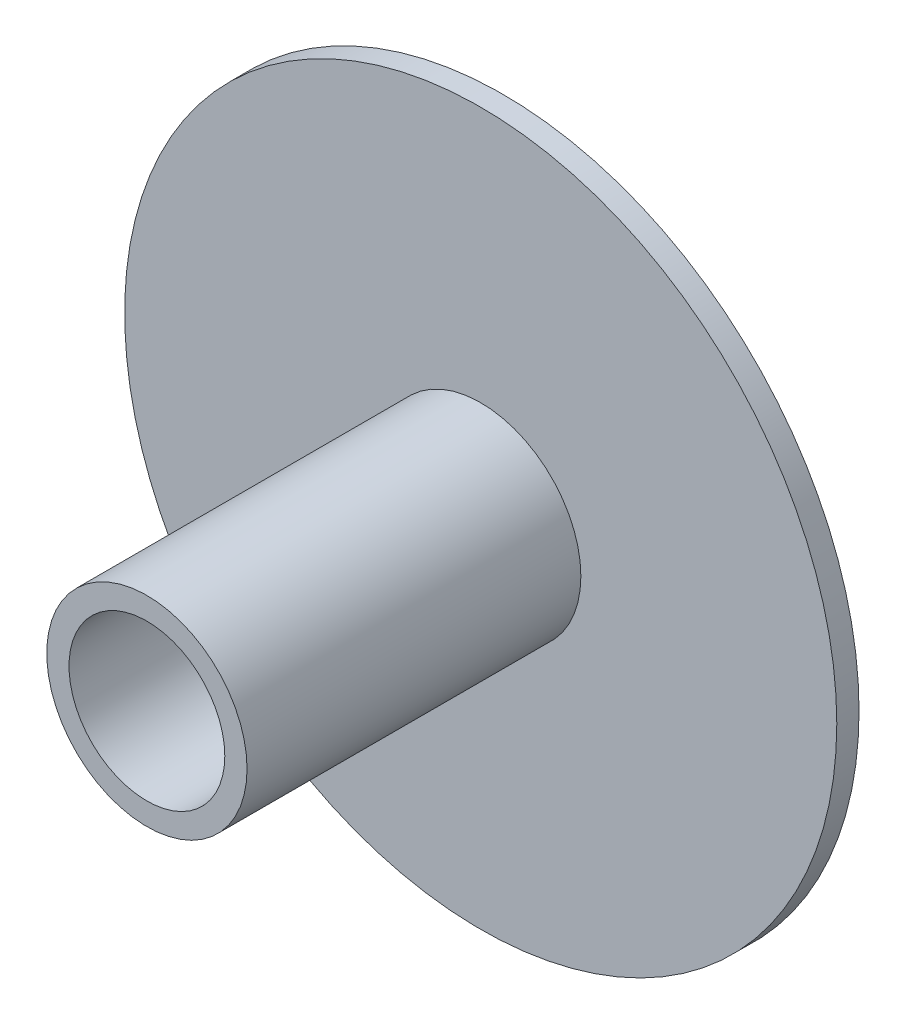
ISO-10303-21;
HEADER;
FILE_DESCRIPTION(('STEP AP214'),'2;1');
FILE_NAME('part.step','',(''),(''),'','','');
FILE_SCHEMA(('AUTOMOTIVE_DESIGN { 1 0 10303 214 1 1 1 1 }'));
ENDSEC;
DATA;
#1=APPLICATION_CONTEXT('core data for automotive mechanical design processes');
#2=APPLICATION_PROTOCOL_DEFINITION('international standard','automotive_design',2000,#1);
#3=PRODUCT_CONTEXT('',#1,'mechanical');
#4=PRODUCT('Part','Part','',(#3));
#5=PRODUCT_RELATED_PRODUCT_CATEGORY('part','',(#4));
#6=PRODUCT_DEFINITION_FORMATION('','',#4);
#7=PRODUCT_DEFINITION_CONTEXT('part definition',#1,'design');
#8=PRODUCT_DEFINITION('design','',#6,#7);
#9=PRODUCT_DEFINITION_SHAPE('','',#8);
#10=(LENGTH_UNIT() NAMED_UNIT(*) SI_UNIT(.MILLI.,.METRE.));
#11=(NAMED_UNIT(*) PLANE_ANGLE_UNIT() SI_UNIT($,.RADIAN.));
#12=(NAMED_UNIT(*) SI_UNIT($,.STERADIAN.) SOLID_ANGLE_UNIT());
#13=UNCERTAINTY_MEASURE_WITH_UNIT(LENGTH_MEASURE(1.E-05),#10,'distance_accuracy_value','');
#14=(GEOMETRIC_REPRESENTATION_CONTEXT(3) GLOBAL_UNCERTAINTY_ASSIGNED_CONTEXT((#13)) GLOBAL_UNIT_ASSIGNED_CONTEXT((#10,
#11,#12)) REPRESENTATION_CONTEXT('',''));
#15=CARTESIAN_POINT('',(0.,0.,0.));
#16=DIRECTION('',(0.,0.,1.));
#17=DIRECTION('',(1.,0.,0.));
#18=AXIS2_PLACEMENT_3D('',#15,#16,#17);
#19=CARTESIAN_POINT('',(0.,0.,1.));
#20=DIRECTION('',(0.,0.,-1.));
#21=DIRECTION('',(-1.,0.,0.));
#22=AXIS2_PLACEMENT_3D('',#19,#20,#21);
#23=CYLINDRICAL_SURFACE('',#22,16.);
#24=CARTESIAN_POINT('',(0.,0.,1.));
#25=DIRECTION('',(0.,0.,1.));
#26=DIRECTION('',(1.,0.,0.));
#27=AXIS2_PLACEMENT_3D('',#24,#25,#26);
#28=CIRCLE('',#27,16.);
#29=CARTESIAN_POINT('',(16.,0.,1.));
#30=VERTEX_POINT('',#29);
#31=EDGE_CURVE('E10',#30,#30,#28,.T.);
#32=ORIENTED_EDGE('',*,*,#31,.F.);
#33=EDGE_LOOP('',(#32));
#34=FACE_BOUND('',#33,.T.);
#35=CARTESIAN_POINT('',(0.,0.,0.));
#36=DIRECTION('',(0.,0.,1.));
#37=DIRECTION('',(1.,0.,0.));
#38=AXIS2_PLACEMENT_3D('',#35,#36,#37);
#39=CIRCLE('',#38,16.);
#40=CARTESIAN_POINT('',(16.,0.,0.));
#41=VERTEX_POINT('',#40);
#42=EDGE_CURVE('E38',#41,#41,#39,.T.);
#43=ORIENTED_EDGE('',*,*,#42,.T.);
#44=EDGE_LOOP('',(#43));
#45=FACE_BOUND('',#44,.T.);
#46=ADVANCED_FACE('F31',(#34,#45),#23,.T.);
#47=CARTESIAN_POINT('',(0.,0.,1.));
#48=DIRECTION('',(0.,0.,1.));
#49=DIRECTION('',(1.,0.,0.));
#50=AXIS2_PLACEMENT_3D('',#47,#48,#49);
#51=PLANE('',#50);
#52=CARTESIAN_POINT('',(0.,0.,1.));
#53=DIRECTION('',(0.,0.,1.));
#54=DIRECTION('',(1.,0.,0.));
#55=AXIS2_PLACEMENT_3D('',#52,#53,#54);
#56=CIRCLE('',#55,4.5);
#57=CARTESIAN_POINT('',(4.5,0.,1.));
#58=VERTEX_POINT('',#57);
#59=EDGE_CURVE('E45',#58,#58,#56,.T.);
#60=ORIENTED_EDGE('',*,*,#59,.F.);
#61=EDGE_LOOP('',(#60));
#62=FACE_BOUND('',#61,.T.);
#63=ORIENTED_EDGE('',*,*,#31,.T.);
#64=EDGE_LOOP('',(#63));
#65=FACE_BOUND('',#64,.T.);
#66=ADVANCED_FACE('F73',(#62,#65),#51,.T.);
#67=CARTESIAN_POINT('',(0.,0.,0.));
#68=DIRECTION('',(0.,0.,1.));
#69=DIRECTION('',(1.,0.,0.));
#70=AXIS2_PLACEMENT_3D('',#67,#68,#69);
#71=PLANE('',#70);
#72=CARTESIAN_POINT('',(0.,0.,0.));
#73=DIRECTION('',(0.,0.,1.));
#74=DIRECTION('',(1.,0.,0.));
#75=AXIS2_PLACEMENT_3D('',#72,#73,#74);
#76=CIRCLE('',#75,3.5);
#77=CARTESIAN_POINT('',(3.5,0.,0.));
#78=VERTEX_POINT('',#77);
#79=EDGE_CURVE('E50',#78,#78,#76,.T.);
#80=ORIENTED_EDGE('',*,*,#79,.T.);
#81=EDGE_LOOP('',(#80));
#82=FACE_BOUND('',#81,.T.);
#83=ORIENTED_EDGE('',*,*,#42,.F.);
#84=EDGE_LOOP('',(#83));
#85=FACE_BOUND('',#84,.T.);
#86=ADVANCED_FACE('F69',(#82,#85),#71,.F.);
#87=CARTESIAN_POINT('',(0.,0.,16.));
#88=DIRECTION('',(0.,0.,-1.));
#89=DIRECTION('',(-1.,0.,0.));
#90=AXIS2_PLACEMENT_3D('',#87,#88,#89);
#91=CYLINDRICAL_SURFACE('',#90,4.5);
#92=CARTESIAN_POINT('',(0.,0.,16.));
#93=DIRECTION('',(0.,0.,1.));
#94=DIRECTION('',(1.,0.,0.));
#95=AXIS2_PLACEMENT_3D('',#92,#93,#94);
#96=CIRCLE('',#95,4.5);
#97=CARTESIAN_POINT('',(4.5,0.,16.));
#98=VERTEX_POINT('',#97);
#99=EDGE_CURVE('E43',#98,#98,#96,.T.);
#100=ORIENTED_EDGE('',*,*,#99,.F.);
#101=EDGE_LOOP('',(#100));
#102=FACE_BOUND('',#101,.T.);
#103=ORIENTED_EDGE('',*,*,#59,.T.);
#104=EDGE_LOOP('',(#103));
#105=FACE_BOUND('',#104,.T.);
#106=ADVANCED_FACE('F63',(#102,#105),#91,.T.);
#107=CARTESIAN_POINT('',(0.,0.,16.));
#108=DIRECTION('',(0.,0.,1.));
#109=DIRECTION('',(1.,0.,0.));
#110=AXIS2_PLACEMENT_3D('',#107,#108,#109);
#111=PLANE('',#110);
#112=CARTESIAN_POINT('',(0.,0.,16.));
#113=DIRECTION('',(0.,0.,1.));
#114=DIRECTION('',(1.,0.,0.));
#115=AXIS2_PLACEMENT_3D('',#112,#113,#114);
#116=CIRCLE('',#115,3.5);
#117=CARTESIAN_POINT('',(3.5,0.,16.));
#118=VERTEX_POINT('',#117);
#119=EDGE_CURVE('E34',#118,#118,#116,.T.);
#120=ORIENTED_EDGE('',*,*,#119,.F.);
#121=EDGE_LOOP('',(#120));
#122=FACE_BOUND('',#121,.T.);
#123=ORIENTED_EDGE('',*,*,#99,.T.);
#124=EDGE_LOOP('',(#123));
#125=FACE_BOUND('',#124,.T.);
#126=ADVANCED_FACE('F60',(#122,#125),#111,.T.);
#127=CARTESIAN_POINT('',(0.,0.,0.));
#128=DIRECTION('',(0.,0.,1.));
#129=DIRECTION('',(1.,0.,0.));
#130=AXIS2_PLACEMENT_3D('',#127,#128,#129);
#131=CYLINDRICAL_SURFACE('',#130,3.5);
#132=ORIENTED_EDGE('',*,*,#119,.T.);
#133=EDGE_LOOP('',(#132));
#134=FACE_BOUND('',#133,.T.);
#135=ORIENTED_EDGE('',*,*,#79,.F.);
#136=EDGE_LOOP('',(#135));
#137=FACE_BOUND('',#136,.T.);
#138=ADVANCED_FACE('F57',(#134,#137),#131,.F.);
#139=CLOSED_SHELL('',(#46,#66,#86,#106,#126,#138));
#140=MANIFOLD_SOLID_BREP('B2',#139);
#141=ADVANCED_BREP_SHAPE_REPRESENTATION('',(#18,#140),#14);
#142=SHAPE_DEFINITION_REPRESENTATION(#9,#141);
ENDSEC;
END-ISO-10303-21;
